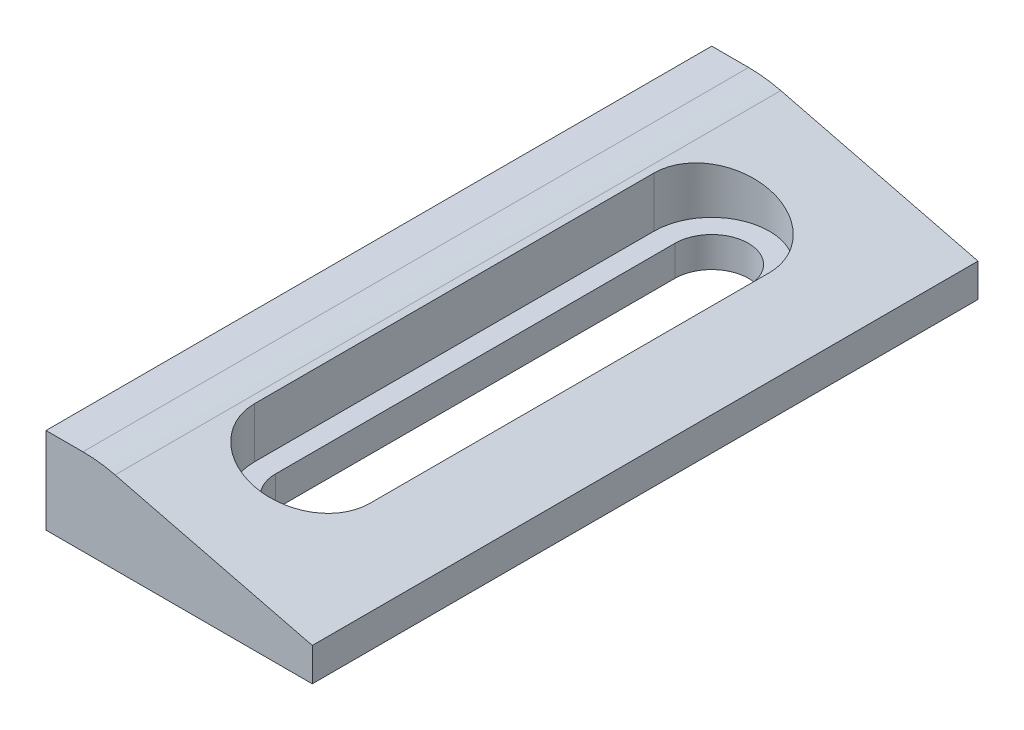
ISO-10303-21;
HEADER;
FILE_DESCRIPTION(('STEP AP214'),'2;1');
FILE_NAME('part.step','',(''),(''),'','','');
FILE_SCHEMA(('AUTOMOTIVE_DESIGN { 1 0 10303 214 1 1 1 1 }'));
ENDSEC;
DATA;
#1=APPLICATION_CONTEXT('core data for automotive mechanical design processes');
#2=APPLICATION_PROTOCOL_DEFINITION('international standard','automotive_design',2000,#1);
#3=PRODUCT_CONTEXT('',#1,'mechanical');
#4=PRODUCT('Part','Part','',(#3));
#5=PRODUCT_RELATED_PRODUCT_CATEGORY('part','',(#4));
#6=PRODUCT_DEFINITION_FORMATION('','',#4);
#7=PRODUCT_DEFINITION_CONTEXT('part definition',#1,'design');
#8=PRODUCT_DEFINITION('design','',#6,#7);
#9=PRODUCT_DEFINITION_SHAPE('','',#8);
#10=(LENGTH_UNIT() NAMED_UNIT(*) SI_UNIT(.MILLI.,.METRE.));
#11=(NAMED_UNIT(*) PLANE_ANGLE_UNIT() SI_UNIT($,.RADIAN.));
#12=(NAMED_UNIT(*) SI_UNIT($,.STERADIAN.) SOLID_ANGLE_UNIT());
#13=UNCERTAINTY_MEASURE_WITH_UNIT(LENGTH_MEASURE(1.E-05),#10,'distance_accuracy_value','');
#14=(GEOMETRIC_REPRESENTATION_CONTEXT(3) GLOBAL_UNCERTAINTY_ASSIGNED_CONTEXT((#13)) GLOBAL_UNIT_ASSIGNED_CONTEXT((#10,
#11,#12)) REPRESENTATION_CONTEXT('',''));
#15=CARTESIAN_POINT('',(0.,0.,0.));
#16=DIRECTION('',(0.,0.,1.));
#17=DIRECTION('',(1.,0.,0.));
#18=AXIS2_PLACEMENT_3D('',#15,#16,#17);
#19=CARTESIAN_POINT('',(0.,0.,63.5));
#20=DIRECTION('',(1.,0.,0.));
#21=DIRECTION('',(0.,0.,-1.));
#22=AXIS2_PLACEMENT_3D('',#19,#20,#21);
#23=PLANE('',#22);
#24=DIRECTION('',(0.,-1.,0.));
#25=VECTOR('',#24,1.);
#26=CARTESIAN_POINT('',(0.,0.,0.));
#27=LINE('',#26,#25);
#28=CARTESIAN_POINT('',(0.,8.23214,0.));
#29=VERTEX_POINT('',#28);
#30=CARTESIAN_POINT('',(0.,0.,0.));
#31=VERTEX_POINT('',#30);
#32=EDGE_CURVE('E189',#29,#31,#27,.T.);
#33=ORIENTED_EDGE('',*,*,#32,.T.);
#34=DIRECTION('',(0.,0.,-1.));
#35=VECTOR('',#34,1.);
#36=CARTESIAN_POINT('',(0.,0.,63.5));
#37=LINE('',#36,#35);
#38=CARTESIAN_POINT('',(0.,0.,63.5));
#39=VERTEX_POINT('',#38);
#40=EDGE_CURVE('E237',#39,#31,#37,.T.);
#41=ORIENTED_EDGE('',*,*,#40,.F.);
#42=DIRECTION('',(0.,-1.,0.));
#43=VECTOR('',#42,1.);
#44=CARTESIAN_POINT('',(0.,0.,63.5));
#45=LINE('',#44,#43);
#46=CARTESIAN_POINT('',(0.,8.23214,63.5));
#47=VERTEX_POINT('',#46);
#48=EDGE_CURVE('E197',#47,#39,#45,.T.);
#49=ORIENTED_EDGE('',*,*,#48,.F.);
#50=DIRECTION('',(0.,0.,-1.));
#51=VECTOR('',#50,1.);
#52=CARTESIAN_POINT('',(0.,8.23214,63.5));
#53=LINE('',#52,#51);
#54=EDGE_CURVE('E211',#47,#29,#53,.T.);
#55=ORIENTED_EDGE('',*,*,#54,.T.);
#56=EDGE_LOOP('',(#33,#41,#49,#55));
#57=FACE_BOUND('',#56,.T.);
#58=ADVANCED_FACE('F34',(#57),#23,.F.);
#59=CARTESIAN_POINT('',(0.,0.,63.5));
#60=DIRECTION('',(0.,1.,0.));
#61=DIRECTION('',(0.,0.,1.));
#62=AXIS2_PLACEMENT_3D('',#59,#60,#61);
#63=PLANE('',#62);
#64=CARTESIAN_POINT('',(12.7,0.,12.7));
#65=DIRECTION('',(0.,1.,0.));
#66=DIRECTION('',(0.,0.,1.));
#67=AXIS2_PLACEMENT_3D('',#64,#65,#66);
#68=CIRCLE('',#67,3.5);
#69=CARTESIAN_POINT('',(16.2,0.,12.7));
#70=VERTEX_POINT('',#69);
#71=CARTESIAN_POINT('',(9.2,0.,12.7));
#72=VERTEX_POINT('',#71);
#73=EDGE_CURVE('E149',#70,#72,#68,.T.);
#74=ORIENTED_EDGE('',*,*,#73,.T.);
#75=DIRECTION('',(0.,0.,1.));
#76=VECTOR('',#75,1.);
#77=CARTESIAN_POINT('',(9.2,0.,0.));
#78=LINE('',#77,#76);
#79=CARTESIAN_POINT('',(9.20000000000001,0.,50.8));
#80=VERTEX_POINT('',#79);
#81=EDGE_CURVE('E48',#72,#80,#78,.T.);
#82=ORIENTED_EDGE('',*,*,#81,.T.);
#83=CARTESIAN_POINT('',(12.7,0.,50.8));
#84=DIRECTION('',(0.,1.,0.));
#85=DIRECTION('',(0.,0.,1.));
#86=AXIS2_PLACEMENT_3D('',#83,#84,#85);
#87=CIRCLE('',#86,3.5);
#88=CARTESIAN_POINT('',(16.2,0.,50.8));
#89=VERTEX_POINT('',#88);
#90=EDGE_CURVE('E146',#80,#89,#87,.T.);
#91=ORIENTED_EDGE('',*,*,#90,.T.);
#92=DIRECTION('',(0.,0.,1.));
#93=VECTOR('',#92,1.);
#94=CARTESIAN_POINT('',(16.2,0.,0.));
#95=LINE('',#94,#93);
#96=EDGE_CURVE('E139',#70,#89,#95,.T.);
#97=ORIENTED_EDGE('',*,*,#96,.F.);
#98=EDGE_LOOP('',(#74,#82,#91,#97));
#99=FACE_BOUND('',#98,.T.);
#100=DIRECTION('',(1.,0.,0.));
#101=VECTOR('',#100,1.);
#102=CARTESIAN_POINT('',(0.,0.,0.));
#103=LINE('',#102,#101);
#104=CARTESIAN_POINT('',(25.4,0.,0.));
#105=VERTEX_POINT('',#104);
#106=EDGE_CURVE('E214',#31,#105,#103,.T.);
#107=ORIENTED_EDGE('',*,*,#106,.T.);
#108=DIRECTION('',(0.,0.,-1.));
#109=VECTOR('',#108,1.);
#110=CARTESIAN_POINT('',(25.4,0.,63.5));
#111=LINE('',#110,#109);
#112=CARTESIAN_POINT('',(25.4,0.,63.5));
#113=VERTEX_POINT('',#112);
#114=EDGE_CURVE('E234',#113,#105,#111,.T.);
#115=ORIENTED_EDGE('',*,*,#114,.F.);
#116=DIRECTION('',(1.,0.,0.));
#117=VECTOR('',#116,1.);
#118=CARTESIAN_POINT('',(0.,0.,63.5));
#119=LINE('',#118,#117);
#120=EDGE_CURVE('E200',#39,#113,#119,.T.);
#121=ORIENTED_EDGE('',*,*,#120,.F.);
#122=ORIENTED_EDGE('',*,*,#40,.T.);
#123=EDGE_LOOP('',(#107,#115,#121,#122));
#124=FACE_BOUND('',#123,.T.);
#125=ADVANCED_FACE('F154',(#99,#124),#63,.F.);
#126=CARTESIAN_POINT('',(25.4,0.,63.5));
#127=DIRECTION('',(-1.,0.,0.));
#128=DIRECTION('',(0.,0.,1.));
#129=AXIS2_PLACEMENT_3D('',#126,#127,#128);
#130=PLANE('',#129);
#131=DIRECTION('',(0.,1.,0.));
#132=VECTOR('',#131,1.);
#133=CARTESIAN_POINT('',(25.4,0.,0.));
#134=LINE('',#133,#132);
#135=CARTESIAN_POINT('',(25.4,3.175,0.));
#136=VERTEX_POINT('',#135);
#137=EDGE_CURVE('E216',#105,#136,#134,.T.);
#138=ORIENTED_EDGE('',*,*,#137,.T.);
#139=DIRECTION('',(0.,0.,-1.));
#140=VECTOR('',#139,1.);
#141=CARTESIAN_POINT('',(25.4,3.175,63.5));
#142=LINE('',#141,#140);
#143=CARTESIAN_POINT('',(25.4,3.175,63.5));
#144=VERTEX_POINT('',#143);
#145=EDGE_CURVE('E231',#144,#136,#142,.T.);
#146=ORIENTED_EDGE('',*,*,#145,.F.);
#147=DIRECTION('',(0.,1.,0.));
#148=VECTOR('',#147,1.);
#149=CARTESIAN_POINT('',(25.4,0.,63.5));
#150=LINE('',#149,#148);
#151=EDGE_CURVE('E203',#113,#144,#150,.T.);
#152=ORIENTED_EDGE('',*,*,#151,.F.);
#153=ORIENTED_EDGE('',*,*,#114,.T.);
#154=EDGE_LOOP('',(#138,#146,#152,#153));
#155=FACE_BOUND('',#154,.T.);
#156=ADVANCED_FACE('F277',(#155),#130,.F.);
#157=CARTESIAN_POINT('',(6.59053703970273,7.85620509424398,63.5));
#158=DIRECTION('',(-0.241508007899998,-0.970398826318424,0.));
#159=DIRECTION('',(0.970398826318424,-0.241508007899998,0.));
#160=AXIS2_PLACEMENT_3D('',#157,#158,#159);
#161=PLANE('',#160);
#162=DIRECTION('',(0.,0.,-1.));
#163=VECTOR('',#162,1.);
#164=CARTESIAN_POINT('',(7.20000000000001,7.704525,63.5));
#165=LINE('',#164,#163);
#166=CARTESIAN_POINT('',(7.20000000000001,7.704525,50.8));
#167=VERTEX_POINT('',#166);
#168=CARTESIAN_POINT('',(7.2,7.704525,12.7));
#169=VERTEX_POINT('',#168);
#170=EDGE_CURVE('E240',#167,#169,#165,.T.);
#171=ORIENTED_EDGE('',*,*,#170,.T.);
#172=CARTESIAN_POINT('',(12.7,6.3357125,12.7));
#173=DIRECTION('',(-0.241508007899998,-0.970398826318424,0.));
#174=DIRECTION('',(-0.970398826318424,0.241508007899998,0.));
#175=AXIS2_PLACEMENT_3D('',#172,#173,#174);
#176=ELLIPSE('',#175,5.66777272481495,5.5);
#177=CARTESIAN_POINT('',(18.2,4.9669,12.7));
#178=VERTEX_POINT('',#177);
#179=EDGE_CURVE('E11',#169,#178,#176,.T.);
#180=ORIENTED_EDGE('',*,*,#179,.T.);
#181=DIRECTION('',(0.,0.,1.));
#182=VECTOR('',#181,1.);
#183=CARTESIAN_POINT('',(18.2,4.9669,63.5));
#184=LINE('',#183,#182);
#185=CARTESIAN_POINT('',(18.2,4.9669,50.8));
#186=VERTEX_POINT('',#185);
#187=EDGE_CURVE('E41',#178,#186,#184,.T.);
#188=ORIENTED_EDGE('',*,*,#187,.T.);
#189=CARTESIAN_POINT('',(12.7,6.3357125,50.8));
#190=DIRECTION('',(-0.241508007899998,-0.970398826318424,0.));
#191=DIRECTION('',(-0.970398826318424,0.241508007899998,0.));
#192=AXIS2_PLACEMENT_3D('',#189,#190,#191);
#193=ELLIPSE('',#192,5.66777272481495,5.5);
#194=EDGE_CURVE('E243',#186,#167,#193,.T.);
#195=ORIENTED_EDGE('',*,*,#194,.T.);
#196=EDGE_LOOP('',(#171,#180,#188,#195));
#197=FACE_BOUND('',#196,.T.);
#198=DIRECTION('',(-0.970398826318424,0.241508007899998,0.));
#199=VECTOR('',#198,1.);
#200=CARTESIAN_POINT('',(6.59053703970273,7.85620509424398,0.));
#201=LINE('',#200,#199);
#202=CARTESIAN_POINT('',(6.59053703970273,7.85620509424398,0.));
#203=VERTEX_POINT('',#202);
#204=EDGE_CURVE('E218',#136,#203,#201,.T.);
#205=ORIENTED_EDGE('',*,*,#204,.T.);
#206=DIRECTION('',(0.,0.,-1.));
#207=VECTOR('',#206,1.);
#208=CARTESIAN_POINT('',(6.59053703970273,7.85620509424398,63.5));
#209=LINE('',#208,#207);
#210=CARTESIAN_POINT('',(6.59053703970273,7.85620509424398,63.5));
#211=VERTEX_POINT('',#210);
#212=EDGE_CURVE('E228',#211,#203,#209,.T.);
#213=ORIENTED_EDGE('',*,*,#212,.F.);
#214=DIRECTION('',(-0.970398826318424,0.241508007899998,0.));
#215=VECTOR('',#214,1.);
#216=CARTESIAN_POINT('',(6.59053703970273,7.85620509424398,63.5));
#217=LINE('',#216,#215);
#218=EDGE_CURVE('E205',#144,#211,#217,.T.);
#219=ORIENTED_EDGE('',*,*,#218,.F.);
#220=ORIENTED_EDGE('',*,*,#145,.T.);
#221=EDGE_LOOP('',(#205,#213,#219,#220));
#222=FACE_BOUND('',#221,.T.);
#223=ADVANCED_FACE('F247',(#197,#222),#161,.F.);
#224=CARTESIAN_POINT('',(3.52338533937276,-4.46786,63.5));
#225=DIRECTION('',(0.,0.,-1.));
#226=DIRECTION('',(-1.,0.,0.));
#227=AXIS2_PLACEMENT_3D('',#224,#225,#226);
#228=CYLINDRICAL_SURFACE('',#227,12.7);
#229=CARTESIAN_POINT('',(3.52338533937276,-4.46786,0.));
#230=DIRECTION('',(0.,0.,1.));
#231=DIRECTION('',(1.,0.,0.));
#232=AXIS2_PLACEMENT_3D('',#229,#230,#231);
#233=CIRCLE('',#232,12.7);
#234=CARTESIAN_POINT('',(3.52338533937276,8.23214,0.));
#235=VERTEX_POINT('',#234);
#236=EDGE_CURVE('E220',#203,#235,#233,.T.);
#237=ORIENTED_EDGE('',*,*,#236,.T.);
#238=DIRECTION('',(0.,0.,-1.));
#239=VECTOR('',#238,1.);
#240=CARTESIAN_POINT('',(3.52338533937276,8.23214,63.5));
#241=LINE('',#240,#239);
#242=CARTESIAN_POINT('',(3.52338533937276,8.23214,63.5));
#243=VERTEX_POINT('',#242);
#244=EDGE_CURVE('E225',#243,#235,#241,.T.);
#245=ORIENTED_EDGE('',*,*,#244,.F.);
#246=CARTESIAN_POINT('',(3.52338533937276,-4.46786,63.5));
#247=DIRECTION('',(0.,0.,1.));
#248=DIRECTION('',(1.,0.,0.));
#249=AXIS2_PLACEMENT_3D('',#246,#247,#248);
#250=CIRCLE('',#249,12.7);
#251=EDGE_CURVE('E207',#211,#243,#250,.T.);
#252=ORIENTED_EDGE('',*,*,#251,.F.);
#253=ORIENTED_EDGE('',*,*,#212,.T.);
#254=EDGE_LOOP('',(#237,#245,#252,#253));
#255=FACE_BOUND('',#254,.T.);
#256=ADVANCED_FACE('F298',(#255),#228,.T.);
#257=CARTESIAN_POINT('',(0.,8.23214,63.5));
#258=DIRECTION('',(0.,-1.,0.));
#259=DIRECTION('',(0.,0.,-1.));
#260=AXIS2_PLACEMENT_3D('',#257,#258,#259);
#261=PLANE('',#260);
#262=DIRECTION('',(-1.,0.,0.));
#263=VECTOR('',#262,1.);
#264=CARTESIAN_POINT('',(0.,8.23214,0.));
#265=LINE('',#264,#263);
#266=EDGE_CURVE('E201',#235,#29,#265,.T.);
#267=ORIENTED_EDGE('',*,*,#266,.T.);
#268=ORIENTED_EDGE('',*,*,#54,.F.);
#269=DIRECTION('',(-1.,0.,0.));
#270=VECTOR('',#269,1.);
#271=CARTESIAN_POINT('',(0.,8.23214,63.5));
#272=LINE('',#271,#270);
#273=EDGE_CURVE('E209',#243,#47,#272,.T.);
#274=ORIENTED_EDGE('',*,*,#273,.F.);
#275=ORIENTED_EDGE('',*,*,#244,.T.);
#276=EDGE_LOOP('',(#267,#268,#274,#275));
#277=FACE_BOUND('',#276,.T.);
#278=ADVANCED_FACE('F296',(#277),#261,.F.);
#279=CARTESIAN_POINT('',(3.52338533937276,-4.46786,63.5));
#280=DIRECTION('',(0.,0.,1.));
#281=DIRECTION('',(1.,0.,0.));
#282=AXIS2_PLACEMENT_3D('',#279,#280,#281);
#283=PLANE('',#282);
#284=ORIENTED_EDGE('',*,*,#48,.T.);
#285=ORIENTED_EDGE('',*,*,#120,.T.);
#286=ORIENTED_EDGE('',*,*,#151,.T.);
#287=ORIENTED_EDGE('',*,*,#218,.T.);
#288=ORIENTED_EDGE('',*,*,#251,.T.);
#289=ORIENTED_EDGE('',*,*,#273,.T.);
#290=EDGE_LOOP('',(#284,#285,#286,#287,#288,#289));
#291=FACE_BOUND('',#290,.T.);
#292=ADVANCED_FACE('F291',(#291),#283,.T.);
#293=CARTESIAN_POINT('',(3.52338533937276,-4.46786,0.));
#294=DIRECTION('',(0.,0.,1.));
#295=DIRECTION('',(1.,0.,0.));
#296=AXIS2_PLACEMENT_3D('',#293,#294,#295);
#297=PLANE('',#296);
#298=ORIENTED_EDGE('',*,*,#32,.F.);
#299=ORIENTED_EDGE('',*,*,#266,.F.);
#300=ORIENTED_EDGE('',*,*,#236,.F.);
#301=ORIENTED_EDGE('',*,*,#204,.F.);
#302=ORIENTED_EDGE('',*,*,#137,.F.);
#303=ORIENTED_EDGE('',*,*,#106,.F.);
#304=EDGE_LOOP('',(#298,#299,#300,#301,#302,#303));
#305=FACE_BOUND('',#304,.T.);
#306=ADVANCED_FACE('F284',(#305),#297,.F.);
#307=CARTESIAN_POINT('',(12.7,2.89814,12.7));
#308=DIRECTION('',(0.,1.,0.));
#309=DIRECTION('',(0.,0.,1.));
#310=AXIS2_PLACEMENT_3D('',#307,#308,#309);
#311=CYLINDRICAL_SURFACE('',#310,5.5);
#312=DIRECTION('',(0.,1.,0.));
#313=VECTOR('',#312,1.);
#314=CARTESIAN_POINT('',(7.2,2.89814,12.7));
#315=LINE('',#314,#313);
#316=CARTESIAN_POINT('',(7.2,2.89814,12.7));
#317=VERTEX_POINT('',#316);
#318=EDGE_CURVE('E56',#317,#169,#315,.T.);
#319=ORIENTED_EDGE('',*,*,#318,.F.);
#320=CARTESIAN_POINT('',(12.7,2.89814,12.7));
#321=DIRECTION('',(0.,1.,0.));
#322=DIRECTION('',(0.,0.,1.));
#323=AXIS2_PLACEMENT_3D('',#320,#321,#322);
#324=CIRCLE('',#323,5.5);
#325=CARTESIAN_POINT('',(18.2,2.89814,12.7));
#326=VERTEX_POINT('',#325);
#327=EDGE_CURVE('E174',#326,#317,#324,.T.);
#328=ORIENTED_EDGE('',*,*,#327,.F.);
#329=DIRECTION('',(0.,1.,0.));
#330=VECTOR('',#329,1.);
#331=CARTESIAN_POINT('',(18.2,2.89814,12.7));
#332=LINE('',#331,#330);
#333=EDGE_CURVE('E186',#326,#178,#332,.T.);
#334=ORIENTED_EDGE('',*,*,#333,.T.);
#335=ORIENTED_EDGE('',*,*,#179,.F.);
#336=EDGE_LOOP('',(#319,#328,#334,#335));
#337=FACE_BOUND('',#336,.T.);
#338=ADVANCED_FACE('F254',(#337),#311,.F.);
#339=CARTESIAN_POINT('',(18.2,2.89814,12.7));
#340=DIRECTION('',(1.,0.,0.));
#341=DIRECTION('',(0.,0.,-1.));
#342=AXIS2_PLACEMENT_3D('',#339,#340,#341);
#343=PLANE('',#342);
#344=ORIENTED_EDGE('',*,*,#333,.F.);
#345=DIRECTION('',(0.,0.,-1.));
#346=VECTOR('',#345,1.);
#347=CARTESIAN_POINT('',(18.2,2.89814,12.7));
#348=LINE('',#347,#346);
#349=CARTESIAN_POINT('',(18.2,2.89814,50.8));
#350=VERTEX_POINT('',#349);
#351=EDGE_CURVE('E183',#350,#326,#348,.T.);
#352=ORIENTED_EDGE('',*,*,#351,.F.);
#353=DIRECTION('',(0.,1.,0.));
#354=VECTOR('',#353,1.);
#355=CARTESIAN_POINT('',(18.2,2.89814,50.8));
#356=LINE('',#355,#354);
#357=EDGE_CURVE('E190',#350,#186,#356,.T.);
#358=ORIENTED_EDGE('',*,*,#357,.T.);
#359=ORIENTED_EDGE('',*,*,#187,.F.);
#360=EDGE_LOOP('',(#344,#352,#358,#359));
#361=FACE_BOUND('',#360,.T.);
#362=ADVANCED_FACE('F250',(#361),#343,.F.);
#363=CARTESIAN_POINT('',(12.7,2.89814,50.8));
#364=DIRECTION('',(0.,1.,0.));
#365=DIRECTION('',(0.,0.,1.));
#366=AXIS2_PLACEMENT_3D('',#363,#364,#365);
#367=CYLINDRICAL_SURFACE('',#366,5.5);
#368=ORIENTED_EDGE('',*,*,#357,.F.);
#369=CARTESIAN_POINT('',(12.7,2.89814,50.8));
#370=DIRECTION('',(0.,1.,0.));
#371=DIRECTION('',(0.,0.,1.));
#372=AXIS2_PLACEMENT_3D('',#369,#370,#371);
#373=CIRCLE('',#372,5.5);
#374=CARTESIAN_POINT('',(7.20000000000001,2.89814,50.8));
#375=VERTEX_POINT('',#374);
#376=EDGE_CURVE('E180',#375,#350,#373,.T.);
#377=ORIENTED_EDGE('',*,*,#376,.F.);
#378=DIRECTION('',(0.,1.,0.));
#379=VECTOR('',#378,1.);
#380=CARTESIAN_POINT('',(7.20000000000001,2.89814,50.8));
#381=LINE('',#380,#379);
#382=EDGE_CURVE('E193',#375,#167,#381,.T.);
#383=ORIENTED_EDGE('',*,*,#382,.T.);
#384=ORIENTED_EDGE('',*,*,#194,.F.);
#385=EDGE_LOOP('',(#368,#377,#383,#384));
#386=FACE_BOUND('',#385,.T.);
#387=ADVANCED_FACE('F259',(#386),#367,.F.);
#388=CARTESIAN_POINT('',(7.2,2.89814,12.7));
#389=DIRECTION('',(-1.,0.,0.));
#390=DIRECTION('',(0.,0.,1.));
#391=AXIS2_PLACEMENT_3D('',#388,#389,#390);
#392=PLANE('',#391);
#393=ORIENTED_EDGE('',*,*,#382,.F.);
#394=DIRECTION('',(0.,0.,1.));
#395=VECTOR('',#394,1.);
#396=CARTESIAN_POINT('',(7.2,2.89814,12.7));
#397=LINE('',#396,#395);
#398=EDGE_CURVE('E177',#317,#375,#397,.T.);
#399=ORIENTED_EDGE('',*,*,#398,.F.);
#400=ORIENTED_EDGE('',*,*,#318,.T.);
#401=ORIENTED_EDGE('',*,*,#170,.F.);
#402=EDGE_LOOP('',(#393,#399,#400,#401));
#403=FACE_BOUND('',#402,.T.);
#404=ADVANCED_FACE('F260',(#403),#392,.F.);
#405=CARTESIAN_POINT('',(12.7,2.89814,12.7));
#406=DIRECTION('',(0.,1.,0.));
#407=DIRECTION('',(0.,0.,1.));
#408=AXIS2_PLACEMENT_3D('',#405,#406,#407);
#409=PLANE('',#408);
#410=DIRECTION('',(0.,0.,-1.));
#411=VECTOR('',#410,1.);
#412=CARTESIAN_POINT('',(16.2,2.89814,12.7));
#413=LINE('',#412,#411);
#414=CARTESIAN_POINT('',(16.2,2.89814,50.8));
#415=VERTEX_POINT('',#414);
#416=CARTESIAN_POINT('',(16.2,2.89814,12.7));
#417=VERTEX_POINT('',#416);
#418=EDGE_CURVE('E142',#415,#417,#413,.T.);
#419=ORIENTED_EDGE('',*,*,#418,.F.);
#420=CARTESIAN_POINT('',(12.7,2.89814,50.8));
#421=DIRECTION('',(0.,1.,0.));
#422=DIRECTION('',(0.,0.,1.));
#423=AXIS2_PLACEMENT_3D('',#420,#421,#422);
#424=CIRCLE('',#423,3.5);
#425=CARTESIAN_POINT('',(9.20000000000001,2.89814,50.8));
#426=VERTEX_POINT('',#425);
#427=EDGE_CURVE('E171',#426,#415,#424,.T.);
#428=ORIENTED_EDGE('',*,*,#427,.F.);
#429=DIRECTION('',(0.,0.,1.));
#430=VECTOR('',#429,1.);
#431=CARTESIAN_POINT('',(9.2,2.89814,12.7));
#432=LINE('',#431,#430);
#433=CARTESIAN_POINT('',(9.2,2.89814,12.7));
#434=VERTEX_POINT('',#433);
#435=EDGE_CURVE('E169',#434,#426,#432,.T.);
#436=ORIENTED_EDGE('',*,*,#435,.F.);
#437=CARTESIAN_POINT('',(12.7,2.89814,12.7));
#438=DIRECTION('',(0.,1.,0.));
#439=DIRECTION('',(0.,0.,1.));
#440=AXIS2_PLACEMENT_3D('',#437,#438,#439);
#441=CIRCLE('',#440,3.5);
#442=EDGE_CURVE('E163',#417,#434,#441,.T.);
#443=ORIENTED_EDGE('',*,*,#442,.F.);
#444=EDGE_LOOP('',(#419,#428,#436,#443));
#445=FACE_BOUND('',#444,.T.);
#446=ORIENTED_EDGE('',*,*,#327,.T.);
#447=ORIENTED_EDGE('',*,*,#398,.T.);
#448=ORIENTED_EDGE('',*,*,#376,.T.);
#449=ORIENTED_EDGE('',*,*,#351,.T.);
#450=EDGE_LOOP('',(#446,#447,#448,#449));
#451=FACE_BOUND('',#450,.T.);
#452=ADVANCED_FACE('F256',(#445,#451),#409,.T.);
#453=CARTESIAN_POINT('',(9.2,0.,0.));
#454=DIRECTION('',(-1.,0.,0.));
#455=DIRECTION('',(0.,0.,1.));
#456=AXIS2_PLACEMENT_3D('',#453,#454,#455);
#457=PLANE('',#456);
#458=ORIENTED_EDGE('',*,*,#435,.T.);
#459=DIRECTION('',(0.,1.,0.));
#460=VECTOR('',#459,1.);
#461=CARTESIAN_POINT('',(9.20000000000001,0.,50.8));
#462=LINE('',#461,#460);
#463=EDGE_CURVE('E164',#80,#426,#462,.T.);
#464=ORIENTED_EDGE('',*,*,#463,.F.);
#465=ORIENTED_EDGE('',*,*,#81,.F.);
#466=DIRECTION('',(0.,1.,0.));
#467=VECTOR('',#466,1.);
#468=CARTESIAN_POINT('',(9.2,0.,12.7));
#469=LINE('',#468,#467);
#470=EDGE_CURVE('E145',#72,#434,#469,.T.);
#471=ORIENTED_EDGE('',*,*,#470,.T.);
#472=EDGE_LOOP('',(#458,#464,#465,#471));
#473=FACE_BOUND('',#472,.T.);
#474=ADVANCED_FACE('F267',(#473),#457,.F.);
#475=CARTESIAN_POINT('',(12.7,0.,50.8));
#476=DIRECTION('',(0.,1.,0.));
#477=DIRECTION('',(0.,0.,1.));
#478=AXIS2_PLACEMENT_3D('',#475,#476,#477);
#479=CYLINDRICAL_SURFACE('',#478,3.5);
#480=ORIENTED_EDGE('',*,*,#427,.T.);
#481=DIRECTION('',(0.,1.,0.));
#482=VECTOR('',#481,1.);
#483=CARTESIAN_POINT('',(16.2,0.,50.8));
#484=LINE('',#483,#482);
#485=EDGE_CURVE('E161',#89,#415,#484,.T.);
#486=ORIENTED_EDGE('',*,*,#485,.F.);
#487=ORIENTED_EDGE('',*,*,#90,.F.);
#488=ORIENTED_EDGE('',*,*,#463,.T.);
#489=EDGE_LOOP('',(#480,#486,#487,#488));
#490=FACE_BOUND('',#489,.T.);
#491=ADVANCED_FACE('F327',(#490),#479,.F.);
#492=CARTESIAN_POINT('',(16.2,0.,0.));
#493=DIRECTION('',(-1.,0.,0.));
#494=DIRECTION('',(0.,0.,1.));
#495=AXIS2_PLACEMENT_3D('',#492,#493,#494);
#496=PLANE('',#495);
#497=DIRECTION('',(0.,1.,0.));
#498=VECTOR('',#497,1.);
#499=CARTESIAN_POINT('',(16.2,0.,12.7));
#500=LINE('',#499,#498);
#501=EDGE_CURVE('E134',#70,#417,#500,.T.);
#502=ORIENTED_EDGE('',*,*,#501,.F.);
#503=ORIENTED_EDGE('',*,*,#96,.T.);
#504=ORIENTED_EDGE('',*,*,#485,.T.);
#505=ORIENTED_EDGE('',*,*,#418,.T.);
#506=EDGE_LOOP('',(#502,#503,#504,#505));
#507=FACE_BOUND('',#506,.T.);
#508=ADVANCED_FACE('F136',(#507),#496,.T.);
#509=CARTESIAN_POINT('',(12.7,0.,12.7));
#510=DIRECTION('',(0.,1.,0.));
#511=DIRECTION('',(0.,0.,1.));
#512=AXIS2_PLACEMENT_3D('',#509,#510,#511);
#513=CYLINDRICAL_SURFACE('',#512,3.5);
#514=ORIENTED_EDGE('',*,*,#442,.T.);
#515=ORIENTED_EDGE('',*,*,#470,.F.);
#516=ORIENTED_EDGE('',*,*,#73,.F.);
#517=ORIENTED_EDGE('',*,*,#501,.T.);
#518=EDGE_LOOP('',(#514,#515,#516,#517));
#519=FACE_BOUND('',#518,.T.);
#520=ADVANCED_FACE('F150',(#519),#513,.F.);
#521=CLOSED_SHELL('',(#58,#125,#156,#223,#256,#278,#292,#306,#338,#362,#387,#404,#452,#474,#491,
#508,#520));
#522=MANIFOLD_SOLID_BREP('B2',#521);
#523=ADVANCED_BREP_SHAPE_REPRESENTATION('',(#18,#522),#14);
#524=SHAPE_DEFINITION_REPRESENTATION(#9,#523);
ENDSEC;
END-ISO-10303-21;
